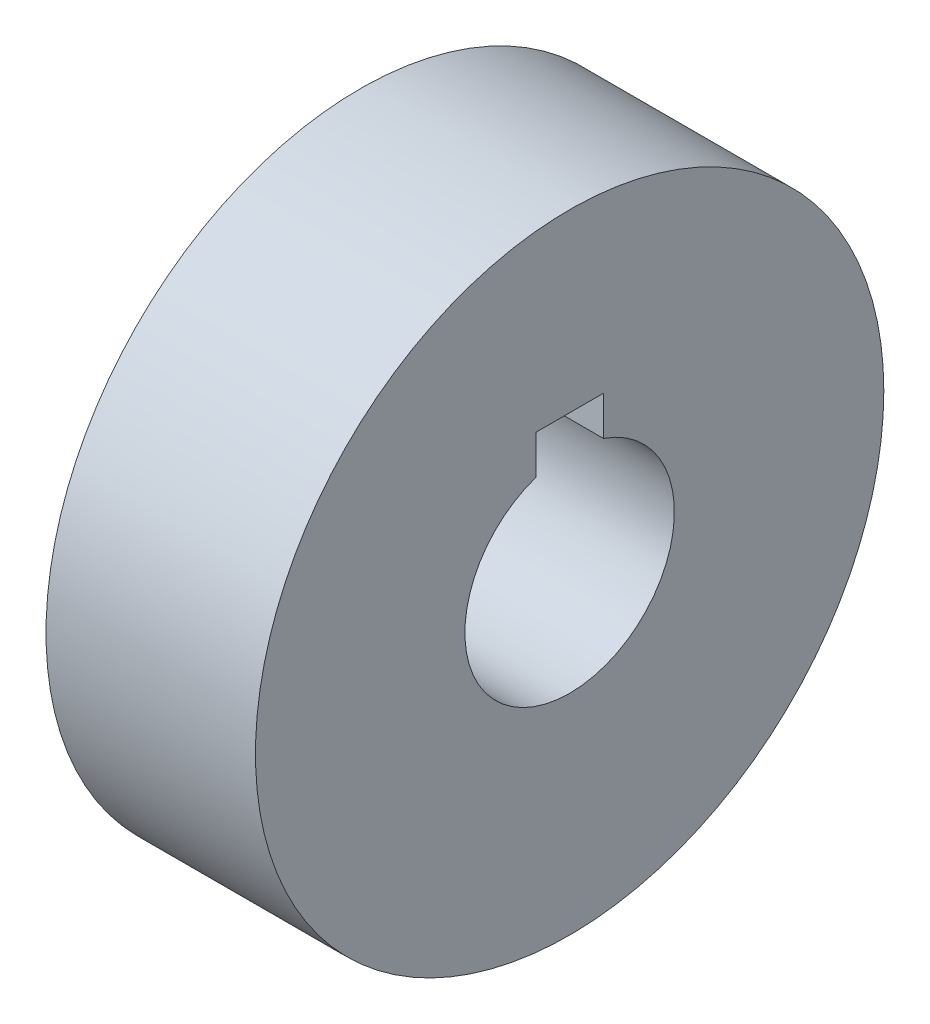
ISO-10303-21;
HEADER;
FILE_DESCRIPTION(('STEP AP214'),'2;1');
FILE_NAME('part.step','',(''),(''),'','','');
FILE_SCHEMA(('AUTOMOTIVE_DESIGN { 1 0 10303 214 1 1 1 1 }'));
ENDSEC;
DATA;
#1=APPLICATION_CONTEXT('core data for automotive mechanical design processes');
#2=APPLICATION_PROTOCOL_DEFINITION('international standard','automotive_design',2000,#1);
#3=PRODUCT_CONTEXT('',#1,'mechanical');
#4=PRODUCT('Part','Part','',(#3));
#5=PRODUCT_RELATED_PRODUCT_CATEGORY('part','',(#4));
#6=PRODUCT_DEFINITION_FORMATION('','',#4);
#7=PRODUCT_DEFINITION_CONTEXT('part definition',#1,'design');
#8=PRODUCT_DEFINITION('design','',#6,#7);
#9=PRODUCT_DEFINITION_SHAPE('','',#8);
#10=(LENGTH_UNIT() NAMED_UNIT(*) SI_UNIT(.MILLI.,.METRE.));
#11=(NAMED_UNIT(*) PLANE_ANGLE_UNIT() SI_UNIT($,.RADIAN.));
#12=(NAMED_UNIT(*) SI_UNIT($,.STERADIAN.) SOLID_ANGLE_UNIT());
#13=UNCERTAINTY_MEASURE_WITH_UNIT(LENGTH_MEASURE(1.E-05),#10,'distance_accuracy_value','');
#14=(GEOMETRIC_REPRESENTATION_CONTEXT(3) GLOBAL_UNCERTAINTY_ASSIGNED_CONTEXT((#13)) GLOBAL_UNIT_ASSIGNED_CONTEXT((#10,
#11,#12)) REPRESENTATION_CONTEXT('',''));
#15=CARTESIAN_POINT('',(0.,0.,0.));
#16=DIRECTION('',(0.,0.,1.));
#17=DIRECTION('',(1.,0.,0.));
#18=AXIS2_PLACEMENT_3D('',#15,#16,#17);
#19=CARTESIAN_POINT('',(10.,0.,0.));
#20=DIRECTION('',(-1.,0.,0.));
#21=DIRECTION('',(0.,0.,1.));
#22=AXIS2_PLACEMENT_3D('',#19,#20,#21);
#23=CYLINDRICAL_SURFACE('',#22,5.);
#24=CARTESIAN_POINT('',(0.,0.,0.));
#25=DIRECTION('',(1.,0.,0.));
#26=DIRECTION('',(0.,0.,-1.));
#27=AXIS2_PLACEMENT_3D('',#24,#25,#26);
#28=CIRCLE('',#27,5.);
#29=CARTESIAN_POINT('',(0.,4.73196685652921,1.61508193869818));
#30=VERTEX_POINT('',#29);
#31=CARTESIAN_POINT('',(0.,4.73196685652921,-1.61508193869818));
#32=VERTEX_POINT('',#31);
#33=EDGE_CURVE('E112',#30,#32,#28,.T.);
#34=ORIENTED_EDGE('',*,*,#33,.F.);
#35=DIRECTION('',(-1.,0.,0.));
#36=VECTOR('',#35,1.);
#37=CARTESIAN_POINT('',(10.,4.73196685652921,1.61508193869818));
#38=LINE('',#37,#36);
#39=CARTESIAN_POINT('',(10.,4.73196685652921,1.61508193869818));
#40=VERTEX_POINT('',#39);
#41=EDGE_CURVE('E11',#40,#30,#38,.T.);
#42=ORIENTED_EDGE('',*,*,#41,.F.);
#43=CARTESIAN_POINT('',(10.,0.,0.));
#44=DIRECTION('',(1.,0.,0.));
#45=DIRECTION('',(0.,0.,-1.));
#46=AXIS2_PLACEMENT_3D('',#43,#44,#45);
#47=CIRCLE('',#46,5.);
#48=CARTESIAN_POINT('',(10.,4.73196685652921,-1.61508193869818));
#49=VERTEX_POINT('',#48);
#50=EDGE_CURVE('E89',#40,#49,#47,.T.);
#51=ORIENTED_EDGE('',*,*,#50,.T.);
#52=DIRECTION('',(-1.,0.,0.));
#53=VECTOR('',#52,1.);
#54=CARTESIAN_POINT('',(10.,4.73196685652921,-1.61508193869818));
#55=LINE('',#54,#53);
#56=EDGE_CURVE('E56',#49,#32,#55,.T.);
#57=ORIENTED_EDGE('',*,*,#56,.T.);
#58=EDGE_LOOP('',(#34,#42,#51,#57));
#59=FACE_BOUND('',#58,.T.);
#60=ADVANCED_FACE('F39',(#59),#23,.F.);
#61=CARTESIAN_POINT('',(10.,0.,1.61508193869818));
#62=DIRECTION('',(0.,0.,1.));
#63=DIRECTION('',(1.,0.,0.));
#64=AXIS2_PLACEMENT_3D('',#61,#62,#63);
#65=PLANE('',#64);
#66=DIRECTION('',(0.,1.,0.));
#67=VECTOR('',#66,1.);
#68=CARTESIAN_POINT('',(0.,0.,1.61508193869818));
#69=LINE('',#68,#67);
#70=CARTESIAN_POINT('',(0.,6.6,1.61508193869818));
#71=VERTEX_POINT('',#70);
#72=EDGE_CURVE('E96',#30,#71,#69,.T.);
#73=ORIENTED_EDGE('',*,*,#72,.T.);
#74=DIRECTION('',(-1.,0.,0.));
#75=VECTOR('',#74,1.);
#76=CARTESIAN_POINT('',(10.,6.6,1.61508193869818));
#77=LINE('',#76,#75);
#78=CARTESIAN_POINT('',(10.,6.6,1.61508193869818));
#79=VERTEX_POINT('',#78);
#80=EDGE_CURVE('E48',#79,#71,#77,.T.);
#81=ORIENTED_EDGE('',*,*,#80,.F.);
#82=DIRECTION('',(0.,1.,0.));
#83=VECTOR('',#82,1.);
#84=CARTESIAN_POINT('',(10.,0.,1.61508193869818));
#85=LINE('',#84,#83);
#86=EDGE_CURVE('E82',#40,#79,#85,.T.);
#87=ORIENTED_EDGE('',*,*,#86,.F.);
#88=ORIENTED_EDGE('',*,*,#41,.T.);
#89=EDGE_LOOP('',(#73,#81,#87,#88));
#90=FACE_BOUND('',#89,.T.);
#91=ADVANCED_FACE('F94',(#90),#65,.F.);
#92=CARTESIAN_POINT('',(10.,6.6,0.));
#93=DIRECTION('',(0.,-1.,0.));
#94=DIRECTION('',(0.,0.,-1.));
#95=AXIS2_PLACEMENT_3D('',#92,#93,#94);
#96=PLANE('',#95);
#97=DIRECTION('',(0.,0.,1.));
#98=VECTOR('',#97,1.);
#99=CARTESIAN_POINT('',(0.,6.6,0.));
#100=LINE('',#99,#98);
#101=CARTESIAN_POINT('',(0.,6.6,-1.61508193869818));
#102=VERTEX_POINT('',#101);
#103=EDGE_CURVE('E117',#102,#71,#100,.T.);
#104=ORIENTED_EDGE('',*,*,#103,.F.);
#105=DIRECTION('',(-1.,0.,0.));
#106=VECTOR('',#105,1.);
#107=CARTESIAN_POINT('',(10.,6.6,-1.61508193869818));
#108=LINE('',#107,#106);
#109=CARTESIAN_POINT('',(10.,6.6,-1.61508193869818));
#110=VERTEX_POINT('',#109);
#111=EDGE_CURVE('E69',#110,#102,#108,.T.);
#112=ORIENTED_EDGE('',*,*,#111,.F.);
#113=DIRECTION('',(0.,0.,1.));
#114=VECTOR('',#113,1.);
#115=CARTESIAN_POINT('',(10.,6.6,0.));
#116=LINE('',#115,#114);
#117=EDGE_CURVE('E88',#110,#79,#116,.T.);
#118=ORIENTED_EDGE('',*,*,#117,.T.);
#119=ORIENTED_EDGE('',*,*,#80,.T.);
#120=EDGE_LOOP('',(#104,#112,#118,#119));
#121=FACE_BOUND('',#120,.T.);
#122=ADVANCED_FACE('F100',(#121),#96,.T.);
#123=CARTESIAN_POINT('',(10.,0.,-1.61508193869818));
#124=DIRECTION('',(0.,0.,1.));
#125=DIRECTION('',(1.,0.,0.));
#126=AXIS2_PLACEMENT_3D('',#123,#124,#125);
#127=PLANE('',#126);
#128=DIRECTION('',(0.,1.,0.));
#129=VECTOR('',#128,1.);
#130=CARTESIAN_POINT('',(0.,0.,-1.61508193869818));
#131=LINE('',#130,#129);
#132=EDGE_CURVE('E120',#32,#102,#131,.T.);
#133=ORIENTED_EDGE('',*,*,#132,.F.);
#134=ORIENTED_EDGE('',*,*,#56,.F.);
#135=DIRECTION('',(0.,1.,0.));
#136=VECTOR('',#135,1.);
#137=CARTESIAN_POINT('',(10.,0.,-1.61508193869818));
#138=LINE('',#137,#136);
#139=EDGE_CURVE('E102',#49,#110,#138,.T.);
#140=ORIENTED_EDGE('',*,*,#139,.T.);
#141=ORIENTED_EDGE('',*,*,#111,.T.);
#142=EDGE_LOOP('',(#133,#134,#140,#141));
#143=FACE_BOUND('',#142,.T.);
#144=ADVANCED_FACE('F134',(#143),#127,.T.);
#145=CARTESIAN_POINT('',(10.,0.,0.));
#146=DIRECTION('',(-1.,0.,0.));
#147=DIRECTION('',(0.,0.,1.));
#148=AXIS2_PLACEMENT_3D('',#145,#146,#147);
#149=CYLINDRICAL_SURFACE('',#148,15.);
#150=CARTESIAN_POINT('',(10.,0.,0.));
#151=DIRECTION('',(1.,0.,0.));
#152=DIRECTION('',(0.,0.,-1.));
#153=AXIS2_PLACEMENT_3D('',#150,#151,#152);
#154=CIRCLE('',#153,15.);
#155=CARTESIAN_POINT('',(10.,0.,-15.));
#156=VERTEX_POINT('',#155);
#157=EDGE_CURVE('E105',#156,#156,#154,.T.);
#158=ORIENTED_EDGE('',*,*,#157,.F.);
#159=EDGE_LOOP('',(#158));
#160=FACE_BOUND('',#159,.T.);
#161=CARTESIAN_POINT('',(0.,0.,0.));
#162=DIRECTION('',(1.,0.,0.));
#163=DIRECTION('',(0.,0.,-1.));
#164=AXIS2_PLACEMENT_3D('',#161,#162,#163);
#165=CIRCLE('',#164,15.);
#166=CARTESIAN_POINT('',(0.,0.,-15.));
#167=VERTEX_POINT('',#166);
#168=EDGE_CURVE('E124',#167,#167,#165,.T.);
#169=ORIENTED_EDGE('',*,*,#168,.T.);
#170=EDGE_LOOP('',(#169));
#171=FACE_BOUND('',#170,.T.);
#172=ADVANCED_FACE('F136',(#160,#171),#149,.T.);
#173=CARTESIAN_POINT('',(10.,0.,0.));
#174=DIRECTION('',(1.,0.,0.));
#175=DIRECTION('',(0.,0.,-1.));
#176=AXIS2_PLACEMENT_3D('',#173,#174,#175);
#177=PLANE('',#176);
#178=ORIENTED_EDGE('',*,*,#50,.F.);
#179=ORIENTED_EDGE('',*,*,#86,.T.);
#180=ORIENTED_EDGE('',*,*,#117,.F.);
#181=ORIENTED_EDGE('',*,*,#139,.F.);
#182=EDGE_LOOP('',(#178,#179,#180,#181));
#183=FACE_BOUND('',#182,.T.);
#184=ORIENTED_EDGE('',*,*,#157,.T.);
#185=EDGE_LOOP('',(#184));
#186=FACE_BOUND('',#185,.T.);
#187=ADVANCED_FACE('F84',(#183,#186),#177,.T.);
#188=CARTESIAN_POINT('',(0.,0.,0.));
#189=DIRECTION('',(1.,0.,0.));
#190=DIRECTION('',(0.,0.,-1.));
#191=AXIS2_PLACEMENT_3D('',#188,#189,#190);
#192=PLANE('',#191);
#193=ORIENTED_EDGE('',*,*,#33,.T.);
#194=ORIENTED_EDGE('',*,*,#132,.T.);
#195=ORIENTED_EDGE('',*,*,#103,.T.);
#196=ORIENTED_EDGE('',*,*,#72,.F.);
#197=EDGE_LOOP('',(#193,#194,#195,#196));
#198=FACE_BOUND('',#197,.T.);
#199=ORIENTED_EDGE('',*,*,#168,.F.);
#200=EDGE_LOOP('',(#199));
#201=FACE_BOUND('',#200,.T.);
#202=ADVANCED_FACE('F174',(#198,#201),#192,.F.);
#203=CLOSED_SHELL('',(#60,#91,#122,#144,#172,#187,#202));
#204=MANIFOLD_SOLID_BREP('B2',#203);
#205=ADVANCED_BREP_SHAPE_REPRESENTATION('',(#18,#204),#14);
#206=SHAPE_DEFINITION_REPRESENTATION(#9,#205);
ENDSEC;
END-ISO-10303-21;
